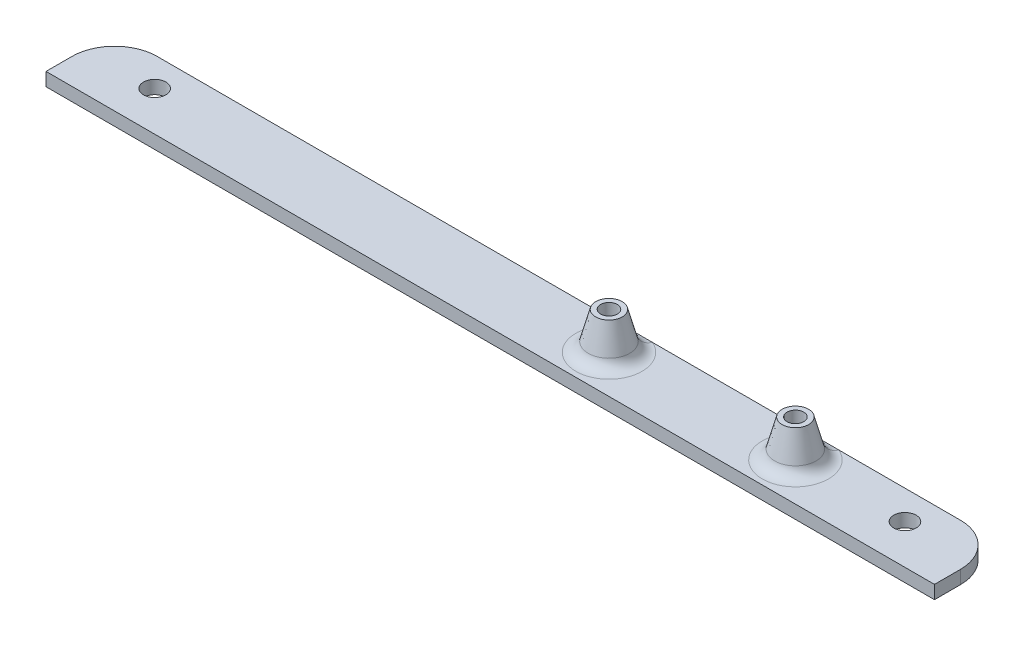
ISO-10303-21;
HEADER;
FILE_DESCRIPTION(('STEP AP214'),'2;1');
FILE_NAME('part.step','',(''),(''),'','','');
FILE_SCHEMA(('AUTOMOTIVE_DESIGN { 1 0 10303 214 1 1 1 1 }'));
ENDSEC;
DATA;
#1=APPLICATION_CONTEXT('core data for automotive mechanical design processes');
#2=APPLICATION_PROTOCOL_DEFINITION('international standard','automotive_design',2000,#1);
#3=PRODUCT_CONTEXT('',#1,'mechanical');
#4=PRODUCT('Part','Part','',(#3));
#5=PRODUCT_RELATED_PRODUCT_CATEGORY('part','',(#4));
#6=PRODUCT_DEFINITION_FORMATION('','',#4);
#7=PRODUCT_DEFINITION_CONTEXT('part definition',#1,'design');
#8=PRODUCT_DEFINITION('design','',#6,#7);
#9=PRODUCT_DEFINITION_SHAPE('','',#8);
#10=(LENGTH_UNIT() NAMED_UNIT(*) SI_UNIT(.MILLI.,.METRE.));
#11=(NAMED_UNIT(*) PLANE_ANGLE_UNIT() SI_UNIT($,.RADIAN.));
#12=(NAMED_UNIT(*) SI_UNIT($,.STERADIAN.) SOLID_ANGLE_UNIT());
#13=UNCERTAINTY_MEASURE_WITH_UNIT(LENGTH_MEASURE(1.E-05),#10,'distance_accuracy_value','');
#14=(GEOMETRIC_REPRESENTATION_CONTEXT(3) GLOBAL_UNCERTAINTY_ASSIGNED_CONTEXT((#13)) GLOBAL_UNIT_ASSIGNED_CONTEXT((#10,
#11,#12)) REPRESENTATION_CONTEXT('',''));
#15=CARTESIAN_POINT('',(0.,0.,0.));
#16=DIRECTION('',(0.,0.,1.));
#17=DIRECTION('',(1.,0.,0.));
#18=AXIS2_PLACEMENT_3D('',#15,#16,#17);
#19=CARTESIAN_POINT('',(0.,0.,0.));
#20=DIRECTION('',(0.,1.,0.));
#21=DIRECTION('',(0.,0.,1.));
#22=AXIS2_PLACEMENT_3D('',#19,#20,#21);
#23=PLANE('',#22);
#24=CARTESIAN_POINT('',(89.5476999999999,0.,-106.114051497006));
#25=DIRECTION('',(0.,1.,0.));
#26=DIRECTION('',(0.,0.,1.));
#27=AXIS2_PLACEMENT_3D('',#24,#25,#26);
#28=CIRCLE('',#27,2.667);
#29=CARTESIAN_POINT('',(89.5476999999999,0.,-103.447051497006));
#30=VERTEX_POINT('',#29);
#31=EDGE_CURVE('E175',#30,#30,#28,.F.);
#32=ORIENTED_EDGE('',*,*,#31,.T.);
#33=EDGE_LOOP('',(#32));
#34=FACE_BOUND('',#33,.T.);
#35=CARTESIAN_POINT('',(-89.5477,0.,-106.114051497006));
#36=DIRECTION('',(0.,1.,0.));
#37=DIRECTION('',(0.,0.,1.));
#38=AXIS2_PLACEMENT_3D('',#35,#36,#37);
#39=CIRCLE('',#38,2.667);
#40=CARTESIAN_POINT('',(-89.5477,0.,-103.447051497006));
#41=VERTEX_POINT('',#40);
#42=EDGE_CURVE('E177',#41,#41,#39,.T.);
#43=ORIENTED_EDGE('',*,*,#42,.F.);
#44=EDGE_LOOP('',(#43));
#45=FACE_BOUND('',#44,.T.);
#46=DIRECTION('',(0.,0.,-1.));
#47=VECTOR('',#46,1.);
#48=CARTESIAN_POINT('',(-106.045,0.,0.));
#49=LINE('',#48,#47);
#50=CARTESIAN_POINT('',(-106.045,0.,-96.6602749649171));
#51=VERTEX_POINT('',#50);
#52=CARTESIAN_POINT('',(-106.045,0.,-102.87));
#53=VERTEX_POINT('',#52);
#54=EDGE_CURVE('E169',#51,#53,#49,.T.);
#55=ORIENTED_EDGE('',*,*,#54,.F.);
#56=DIRECTION('',(1.,0.,0.));
#57=VECTOR('',#56,1.);
#58=CARTESIAN_POINT('',(0.,0.,-96.6602749649171));
#59=LINE('',#58,#57);
#60=CARTESIAN_POINT('',(106.045,0.,-96.6602749649171));
#61=VERTEX_POINT('',#60);
#62=EDGE_CURVE('E136',#51,#61,#59,.T.);
#63=ORIENTED_EDGE('',*,*,#62,.T.);
#64=DIRECTION('',(0.,0.,-1.));
#65=VECTOR('',#64,1.);
#66=CARTESIAN_POINT('',(106.045,0.,0.));
#67=LINE('',#66,#65);
#68=CARTESIAN_POINT('',(106.045,0.,-102.87));
#69=VERTEX_POINT('',#68);
#70=EDGE_CURVE('E140',#61,#69,#67,.T.);
#71=ORIENTED_EDGE('',*,*,#70,.T.);
#72=CARTESIAN_POINT('',(95.885,0.,-102.87));
#73=DIRECTION('',(0.,1.,0.));
#74=DIRECTION('',(0.,0.,1.));
#75=AXIS2_PLACEMENT_3D('',#72,#73,#74);
#76=CIRCLE('',#75,10.16);
#77=CARTESIAN_POINT('',(95.885,0.,-113.03));
#78=VERTEX_POINT('',#77);
#79=EDGE_CURVE('E186',#69,#78,#76,.T.);
#80=ORIENTED_EDGE('',*,*,#79,.T.);
#81=DIRECTION('',(1.,0.,0.));
#82=VECTOR('',#81,1.);
#83=CARTESIAN_POINT('',(0.,0.,-113.03));
#84=LINE('',#83,#82);
#85=CARTESIAN_POINT('',(66.8498739354386,0.,-113.03));
#86=VERTEX_POINT('',#85);
#87=EDGE_CURVE('E170',#86,#78,#84,.T.);
#88=ORIENTED_EDGE('',*,*,#87,.F.);
#89=CARTESIAN_POINT('',(63.7173352185795,0.,-105.789904102201));
#90=DIRECTION('',(0.,1.,0.));
#91=DIRECTION('',(0.,0.,1.));
#92=AXIS2_PLACEMENT_3D('',#89,#90,#91);
#93=CIRCLE('',#92,7.88871265935987);
#94=CARTESIAN_POINT('',(60.5847965017205,0.,-113.03));
#95=VERTEX_POINT('',#94);
#96=EDGE_CURVE('E226',#86,#95,#93,.F.);
#97=ORIENTED_EDGE('',*,*,#96,.T.);
#98=CARTESIAN_POINT('',(22.3490739354386,0.,-113.03));
#99=VERTEX_POINT('',#98);
#100=EDGE_CURVE('E343',#99,#95,#84,.T.);
#101=ORIENTED_EDGE('',*,*,#100,.F.);
#102=CARTESIAN_POINT('',(19.2165352185795,0.,-105.789904102201));
#103=DIRECTION('',(0.,1.,0.));
#104=DIRECTION('',(0.,0.,1.));
#105=AXIS2_PLACEMENT_3D('',#102,#103,#104);
#106=CIRCLE('',#105,7.88871265935987);
#107=CARTESIAN_POINT('',(16.0839965017205,0.,-113.03));
#108=VERTEX_POINT('',#107);
#109=EDGE_CURVE('E215',#99,#108,#106,.F.);
#110=ORIENTED_EDGE('',*,*,#109,.T.);
#111=CARTESIAN_POINT('',(-95.885,0.,-113.03));
#112=VERTEX_POINT('',#111);
#113=EDGE_CURVE('E164',#112,#108,#84,.T.);
#114=ORIENTED_EDGE('',*,*,#113,.F.);
#115=CARTESIAN_POINT('',(-95.885,0.,-102.87));
#116=DIRECTION('',(0.,1.,0.));
#117=DIRECTION('',(0.,0.,1.));
#118=AXIS2_PLACEMENT_3D('',#115,#116,#117);
#119=CIRCLE('',#118,10.16);
#120=EDGE_CURVE('E185',#112,#53,#119,.T.);
#121=ORIENTED_EDGE('',*,*,#120,.T.);
#122=EDGE_LOOP('',(#55,#63,#71,#80,#88,#97,#101,#110,#114,#121));
#123=FACE_BOUND('',#122,.T.);
#124=ADVANCED_FACE('F47',(#34,#45,#123),#23,.T.);
#125=CARTESIAN_POINT('',(106.045,-3.175,0.));
#126=DIRECTION('',(1.,0.,0.));
#127=DIRECTION('',(0.,0.,-1.));
#128=AXIS2_PLACEMENT_3D('',#125,#126,#127);
#129=PLANE('',#128);
#130=ORIENTED_EDGE('',*,*,#70,.F.);
#131=DIRECTION('',(0.,-1.,0.));
#132=VECTOR('',#131,1.);
#133=CARTESIAN_POINT('',(106.045,-3.175,-96.6602749649171));
#134=LINE('',#133,#132);
#135=CARTESIAN_POINT('',(106.045,-3.175,-96.6602749649171));
#136=VERTEX_POINT('',#135);
#137=EDGE_CURVE('E126',#61,#136,#134,.T.);
#138=ORIENTED_EDGE('',*,*,#137,.T.);
#139=DIRECTION('',(0.,0.,-1.));
#140=VECTOR('',#139,1.);
#141=CARTESIAN_POINT('',(106.045,-3.175,0.));
#142=LINE('',#141,#140);
#143=CARTESIAN_POINT('',(106.045,-3.175,-102.87));
#144=VERTEX_POINT('',#143);
#145=EDGE_CURVE('E133',#136,#144,#142,.T.);
#146=ORIENTED_EDGE('',*,*,#145,.T.);
#147=DIRECTION('',(0.,1.,0.));
#148=VECTOR('',#147,1.);
#149=CARTESIAN_POINT('',(106.045,0.,-102.87));
#150=LINE('',#149,#148);
#151=EDGE_CURVE('E165',#144,#69,#150,.T.);
#152=ORIENTED_EDGE('',*,*,#151,.T.);
#153=EDGE_LOOP('',(#130,#138,#146,#152));
#154=FACE_BOUND('',#153,.T.);
#155=ADVANCED_FACE('F134',(#154),#129,.T.);
#156=CARTESIAN_POINT('',(-106.045,-3.175,0.));
#157=DIRECTION('',(1.,0.,0.));
#158=DIRECTION('',(0.,0.,-1.));
#159=AXIS2_PLACEMENT_3D('',#156,#157,#158);
#160=PLANE('',#159);
#161=DIRECTION('',(0.,-1.,0.));
#162=VECTOR('',#161,1.);
#163=CARTESIAN_POINT('',(-106.045,-3.175,-96.6602749649171));
#164=LINE('',#163,#162);
#165=CARTESIAN_POINT('',(-106.045,-3.175,-96.6602749649171));
#166=VERTEX_POINT('',#165);
#167=EDGE_CURVE('E61',#51,#166,#164,.T.);
#168=ORIENTED_EDGE('',*,*,#167,.F.);
#169=ORIENTED_EDGE('',*,*,#54,.T.);
#170=DIRECTION('',(0.,1.,0.));
#171=VECTOR('',#170,1.);
#172=CARTESIAN_POINT('',(-106.045,-3.175,-102.87));
#173=LINE('',#172,#171);
#174=CARTESIAN_POINT('',(-106.045,-3.175,-102.87));
#175=VERTEX_POINT('',#174);
#176=EDGE_CURVE('E203',#53,#175,#173,.F.);
#177=ORIENTED_EDGE('',*,*,#176,.T.);
#178=DIRECTION('',(0.,0.,-1.));
#179=VECTOR('',#178,1.);
#180=CARTESIAN_POINT('',(-106.045,-3.175,0.));
#181=LINE('',#180,#179);
#182=EDGE_CURVE('E147',#166,#175,#181,.T.);
#183=ORIENTED_EDGE('',*,*,#182,.F.);
#184=EDGE_LOOP('',(#168,#169,#177,#183));
#185=FACE_BOUND('',#184,.T.);
#186=ADVANCED_FACE('F387',(#185),#160,.F.);
#187=CARTESIAN_POINT('',(0.,-3.175,0.));
#188=DIRECTION('',(0.,1.,0.));
#189=DIRECTION('',(0.,0.,1.));
#190=AXIS2_PLACEMENT_3D('',#187,#188,#189);
#191=PLANE('',#190);
#192=CARTESIAN_POINT('',(-89.5477,-3.175,-106.114051497006));
#193=DIRECTION('',(0.,1.,0.));
#194=DIRECTION('',(0.,0.,1.));
#195=AXIS2_PLACEMENT_3D('',#192,#193,#194);
#196=CIRCLE('',#195,2.667);
#197=CARTESIAN_POINT('',(-89.5477,-3.175,-103.447051497006));
#198=VERTEX_POINT('',#197);
#199=EDGE_CURVE('E152',#198,#198,#196,.T.);
#200=ORIENTED_EDGE('',*,*,#199,.T.);
#201=EDGE_LOOP('',(#200));
#202=FACE_BOUND('',#201,.T.);
#203=CARTESIAN_POINT('',(89.5476999999999,-3.175,-106.114051497006));
#204=DIRECTION('',(0.,1.,0.));
#205=DIRECTION('',(0.,0.,1.));
#206=AXIS2_PLACEMENT_3D('',#203,#204,#205);
#207=CIRCLE('',#206,2.667);
#208=CARTESIAN_POINT('',(89.5476999999999,-3.175,-103.447051497006));
#209=VERTEX_POINT('',#208);
#210=EDGE_CURVE('E149',#209,#209,#207,.F.);
#211=ORIENTED_EDGE('',*,*,#210,.F.);
#212=EDGE_LOOP('',(#211));
#213=FACE_BOUND('',#212,.T.);
#214=DIRECTION('',(1.,0.,0.));
#215=VECTOR('',#214,1.);
#216=CARTESIAN_POINT('',(0.,-3.175,-96.6602749649171));
#217=LINE('',#216,#215);
#218=EDGE_CURVE('E12',#166,#136,#217,.T.);
#219=ORIENTED_EDGE('',*,*,#218,.F.);
#220=ORIENTED_EDGE('',*,*,#182,.T.);
#221=CARTESIAN_POINT('',(-95.885,-3.175,-102.87));
#222=DIRECTION('',(0.,1.,0.));
#223=DIRECTION('',(0.,0.,1.));
#224=AXIS2_PLACEMENT_3D('',#221,#222,#223);
#225=CIRCLE('',#224,10.16);
#226=CARTESIAN_POINT('',(-95.885,-3.175,-113.03));
#227=VERTEX_POINT('',#226);
#228=EDGE_CURVE('E197',#175,#227,#225,.F.);
#229=ORIENTED_EDGE('',*,*,#228,.T.);
#230=DIRECTION('',(1.,0.,0.));
#231=VECTOR('',#230,1.);
#232=CARTESIAN_POINT('',(0.,-3.175,-113.03));
#233=LINE('',#232,#231);
#234=CARTESIAN_POINT('',(95.885,-3.175,-113.03));
#235=VERTEX_POINT('',#234);
#236=EDGE_CURVE('E154',#227,#235,#233,.T.);
#237=ORIENTED_EDGE('',*,*,#236,.T.);
#238=CARTESIAN_POINT('',(95.885,-3.175,-102.87));
#239=DIRECTION('',(0.,1.,0.));
#240=DIRECTION('',(0.,0.,1.));
#241=AXIS2_PLACEMENT_3D('',#238,#239,#240);
#242=CIRCLE('',#241,10.16);
#243=EDGE_CURVE('E145',#235,#144,#242,.F.);
#244=ORIENTED_EDGE('',*,*,#243,.T.);
#245=ORIENTED_EDGE('',*,*,#145,.F.);
#246=EDGE_LOOP('',(#219,#220,#229,#237,#244,#245));
#247=FACE_BOUND('',#246,.T.);
#248=ADVANCED_FACE('F143',(#202,#213,#247),#191,.F.);
#249=CARTESIAN_POINT('',(0.,-3.175,-113.03));
#250=DIRECTION('',(0.,0.,1.));
#251=DIRECTION('',(1.,0.,0.));
#252=AXIS2_PLACEMENT_3D('',#249,#250,#251);
#253=PLANE('',#252);
#254=ORIENTED_EDGE('',*,*,#113,.T.);
#255=EDGE_CURVE('E167',#108,#99,#84,.T.);
#256=ORIENTED_EDGE('',*,*,#255,.T.);
#257=ORIENTED_EDGE('',*,*,#100,.T.);
#258=EDGE_CURVE('E339',#95,#86,#84,.T.);
#259=ORIENTED_EDGE('',*,*,#258,.T.);
#260=ORIENTED_EDGE('',*,*,#87,.T.);
#261=DIRECTION('',(0.,1.,0.));
#262=VECTOR('',#261,1.);
#263=CARTESIAN_POINT('',(95.885,-3.175,-113.03));
#264=LINE('',#263,#262);
#265=EDGE_CURVE('E196',#78,#235,#264,.F.);
#266=ORIENTED_EDGE('',*,*,#265,.T.);
#267=ORIENTED_EDGE('',*,*,#236,.F.);
#268=DIRECTION('',(0.,1.,0.));
#269=VECTOR('',#268,1.);
#270=CARTESIAN_POINT('',(-95.885,-3.175,-113.03));
#271=LINE('',#270,#269);
#272=EDGE_CURVE('E195',#227,#112,#271,.T.);
#273=ORIENTED_EDGE('',*,*,#272,.T.);
#274=EDGE_LOOP('',(#254,#256,#257,#259,#260,#266,#267,#273));
#275=FACE_BOUND('',#274,.T.);
#276=ADVANCED_FACE('F341',(#275),#253,.F.);
#277=CARTESIAN_POINT('',(89.5476999999999,-3.175,-106.114051497006));
#278=DIRECTION('',(0.,1.,0.));
#279=DIRECTION('',(0.,0.,1.));
#280=AXIS2_PLACEMENT_3D('',#277,#278,#279);
#281=CYLINDRICAL_SURFACE('',#280,2.667);
#282=ORIENTED_EDGE('',*,*,#210,.T.);
#283=EDGE_LOOP('',(#282));
#284=FACE_BOUND('',#283,.T.);
#285=ORIENTED_EDGE('',*,*,#31,.F.);
#286=EDGE_LOOP('',(#285));
#287=FACE_BOUND('',#286,.T.);
#288=ADVANCED_FACE('F418',(#284,#287),#281,.F.);
#289=CARTESIAN_POINT('',(-89.5477,-3.175,-106.114051497006));
#290=DIRECTION('',(0.,1.,0.));
#291=DIRECTION('',(0.,0.,1.));
#292=AXIS2_PLACEMENT_3D('',#289,#290,#291);
#293=CYLINDRICAL_SURFACE('',#292,2.667);
#294=ORIENTED_EDGE('',*,*,#199,.F.);
#295=EDGE_LOOP('',(#294));
#296=FACE_BOUND('',#295,.T.);
#297=ORIENTED_EDGE('',*,*,#42,.T.);
#298=EDGE_LOOP('',(#297));
#299=FACE_BOUND('',#298,.T.);
#300=ADVANCED_FACE('F430',(#296,#299),#293,.F.);
#301=CARTESIAN_POINT('',(95.885,-3.175,-102.87));
#302=DIRECTION('',(0.,-1.,0.));
#303=DIRECTION('',(0.,0.,-1.));
#304=AXIS2_PLACEMENT_3D('',#301,#302,#303);
#305=CYLINDRICAL_SURFACE('',#304,10.16);
#306=ORIENTED_EDGE('',*,*,#243,.F.);
#307=ORIENTED_EDGE('',*,*,#265,.F.);
#308=ORIENTED_EDGE('',*,*,#79,.F.);
#309=ORIENTED_EDGE('',*,*,#151,.F.);
#310=EDGE_LOOP('',(#306,#307,#308,#309));
#311=FACE_BOUND('',#310,.T.);
#312=ADVANCED_FACE('F333',(#311),#305,.T.);
#313=CARTESIAN_POINT('',(-95.885,-3.175,-102.87));
#314=DIRECTION('',(0.,1.,0.));
#315=DIRECTION('',(0.,0.,1.));
#316=AXIS2_PLACEMENT_3D('',#313,#314,#315);
#317=CYLINDRICAL_SURFACE('',#316,10.16);
#318=ORIENTED_EDGE('',*,*,#228,.F.);
#319=ORIENTED_EDGE('',*,*,#176,.F.);
#320=ORIENTED_EDGE('',*,*,#120,.F.);
#321=ORIENTED_EDGE('',*,*,#272,.F.);
#322=EDGE_LOOP('',(#318,#319,#320,#321));
#323=FACE_BOUND('',#322,.T.);
#324=ADVANCED_FACE('F409',(#323),#317,.T.);
#325=CARTESIAN_POINT('',(19.2165352185795,0.,-105.789904102201));
#326=DIRECTION('',(0.,-1.,0.));
#327=DIRECTION('',(0.,0.,1.));
#328=AXIS2_PLACEMENT_3D('',#325,#326,#327);
#329=CONICAL_SURFACE('',#328,5.5499,0.26179938779915);
#330=CARTESIAN_POINT('',(19.2165352185795,2.25911955052751,-105.789904102201));
#331=DIRECTION('',(0.,-1.,0.));
#332=DIRECTION('',(0.,0.,-1.));
#333=AXIS2_PLACEMENT_3D('',#330,#331,#332);
#334=CIRCLE('',#333,4.94457074083079);
#335=CARTESIAN_POINT('',(17.2530894761968,2.25911955052751,-110.32792797034));
#336=VERTEX_POINT('',#335);
#337=CARTESIAN_POINT('',(21.1799809609623,2.25911955052751,-110.32792797034));
#338=VERTEX_POINT('',#337);
#339=EDGE_CURVE('E73',#336,#338,#334,.F.);
#340=ORIENTED_EDGE('',*,*,#339,.T.);
#341=CARTESIAN_POINT('',(14.9132160822023,0.,-113.03));
#342=CARTESIAN_POINT('',(16.3812284406314,-0.471610176472769,-110.716689873763));
#343=CARTESIAN_POINT('',(16.5159111278348,2.19768719480201,-109.951449845618));
#344=CARTESIAN_POINT('',(15.0990784939874,0.,-113.03));
#345=CARTESIAN_POINT('',(16.4641749273153,-0.37810453877888,-110.731149070508));
#346=CARTESIAN_POINT('',(16.6337880743699,2.22073043175689,-110.0206219783));
#347=CARTESIAN_POINT('',(15.2891512085933,0.,-113.03));
#348=CARTESIAN_POINT('',(16.5595076503276,-0.291310692988242,-110.754911667385));
#349=CARTESIAN_POINT('',(16.753758286454,2.23603311554467,-110.086830867375));
#350=CARTESIAN_POINT('',(15.6765885009795,0.,-113.03));
#351=CARTESIAN_POINT('',(16.7692330116348,-0.135034139183143,-110.812596553631));
#352=CARTESIAN_POINT('',(16.9975803656631,2.25516482520164,-110.211914543576));
#353=CARTESIAN_POINT('',(15.8739477906859,0.,-113.03));
#354=CARTESIAN_POINT('',(16.8834220730703,-0.0649534001113206,-110.846345864705));
#355=CARTESIAN_POINT('',(17.1214294082793,2.25900201242316,-110.270794518932));
#356=CARTESIAN_POINT('',(16.2759657908782,0.,-113.03));
#357=CARTESIAN_POINT('',(17.1285112039152,0.0581907318585436,-110.916749829954));
#358=CARTESIAN_POINT('',(17.3734173273652,2.2592320554057,-110.380151463016));
#359=CARTESIAN_POINT('',(16.480652416629,0.,-113.03));
#360=CARTESIAN_POINT('',(17.2595459553542,0.111718452204252,-110.953472750415));
#361=CARTESIAN_POINT('',(17.5015724619864,2.25559259317266,-110.430590928374));
#362=CARTESIAN_POINT('',(16.8956316552266,0.,-113.03));
#363=CARTESIAN_POINT('',(17.5345229730299,0.203225693554277,-111.023919777695));
#364=CARTESIAN_POINT('',(17.7613704328971,2.24449770506473,-110.52160305541));
#365=CARTESIAN_POINT('',(17.1059252576775,0.,-113.03));
#366=CARTESIAN_POINT('',(17.6787428506495,0.241613818596918,-111.057815490545));
#367=CARTESIAN_POINT('',(17.893013884832,2.23704160128831,-110.562173962373));
#368=CARTESIAN_POINT('',(17.5360200201119,0.,-113.03));
#369=CARTESIAN_POINT('',(17.9802045437102,0.305692516791633,-111.11904132115));
#370=CARTESIAN_POINT('',(18.1623805275689,2.22143845764112,-110.633181037182));
#371=CARTESIAN_POINT('',(17.7559285199165,0.,-113.03));
#372=CARTESIAN_POINT('',(18.138199595648,0.331376845521503,-111.146425349311));
#373=CARTESIAN_POINT('',(18.3001739042294,2.21327934440253,-110.663358254519));
#374=CARTESIAN_POINT('',(18.1990863514627,0.,-113.03));
#375=CARTESIAN_POINT('',(18.4605307480783,0.3707934765969,-111.190461137269));
#376=CARTESIAN_POINT('',(18.5780180329939,2.19929658269627,-110.711256920692));
#377=CARTESIAN_POINT('',(18.4223353109197,0.,-113.03));
#378=CARTESIAN_POINT('',(18.6255049055098,0.384709441433339,-111.20729633352));
#379=CARTESIAN_POINT('',(18.7180685336801,2.19347267595798,-110.728979747132));
#380=CARTESIAN_POINT('',(18.8697270506103,0.,-113.03));
#381=CARTESIAN_POINT('',(18.957448010026,0.40199512408667,-111.228468577268));
#382=CARTESIAN_POINT('',(18.998827737933,2.18601921120185,-110.751277812987));
#383=CARTESIAN_POINT('',(19.0938643922879,0.,-113.03));
#384=CARTESIAN_POINT('',(19.1251315217836,0.405477478706701,-111.232940617246));
#385=CARTESIAN_POINT('',(19.1395327056684,2.18437577407803,-110.755896563676));
#386=CARTESIAN_POINT('',(19.5418429696453,0.,-113.03));
#387=CARTESIAN_POINT('',(19.4591659853686,0.402449506842503,-111.229139764229));
#388=CARTESIAN_POINT('',(19.42073840293,2.18574760244863,-110.751925778176));
#389=CARTESIAN_POINT('',(19.7656842129895,0.,-113.03));
#390=CARTESIAN_POINT('',(19.6262654254359,0.395925908517852,-111.220850081048));
#391=CARTESIAN_POINT('',(19.5612391377523,2.1887627448996,-110.743336590839));
#392=CARTESIAN_POINT('',(20.1967557100874,0.,-113.03));
#393=CARTESIAN_POINT('',(19.9446603690179,0.373079135694928,-111.193445246691));
#394=CARTESIAN_POINT('',(19.8316954028262,2.19820153688403,-110.71426489814));
#395=CARTESIAN_POINT('',(20.4041232204609,0.,-113.03));
#396=CARTESIAN_POINT('',(20.0969229007197,0.35732440704069,-111.174957743806));
#397=CARTESIAN_POINT('',(19.9617447779844,2.2043918945923,-110.694588324031));
#398=CARTESIAN_POINT('',(20.8156397295903,0.,-113.03));
#399=CARTESIAN_POINT('',(20.3941674162368,0.315398262594447,-111.129531676619));
#400=CARTESIAN_POINT('',(20.2196835506754,2.21827733561273,-110.644599952071));
#401=CARTESIAN_POINT('',(21.0197886823148,0.,-113.03));
#402=CARTESIAN_POINT('',(20.5396421053324,0.289057321136175,-111.102434217699));
#403=CARTESIAN_POINT('',(20.3475729173178,2.22597244042458,-110.614288002259));
#404=CARTESIAN_POINT('',(21.4241653799833,0.,-113.03));
#405=CARTESIAN_POINT('',(20.8208801710518,0.224320533245156,-111.042510987716));
#406=CARTESIAN_POINT('',(20.6007981185568,2.24043329594097,-110.543790918138));
#407=CARTESIAN_POINT('',(21.6243850956624,0.,-113.03));
#408=CARTESIAN_POINT('',(20.9569951675863,0.185636448625781,-111.00949718378));
#409=CARTESIAN_POINT('',(20.7261287420168,2.24719728537939,-110.503587462983));
#410=CARTESIAN_POINT('',(22.0196304597248,0.,-113.03));
#411=CARTESIAN_POINT('',(21.216619384798,0.0945728075647432,-110.941594358031));
#412=CARTESIAN_POINT('',(20.9735819799053,2.25683842800554,-110.414286220727));
#413=CARTESIAN_POINT('',(22.2146562497031,0.,-113.03));
#414=CARTESIAN_POINT('',(21.3403468438393,0.0418205212938573,-110.906563701227));
#415=CARTESIAN_POINT('',(21.0957046817857,2.25971568725855,-110.365188676379));
#416=CARTESIAN_POINT('',(22.5802342987054,0.,-113.03));
#417=CARTESIAN_POINT('',(21.5612736124322,-0.0727137151742717,-110.842891904783));
#418=CARTESIAN_POINT('',(21.3249002774319,2.25838294533514,-110.264237892472));
#419=CARTESIAN_POINT('',(22.7513369826149,0.,-113.03));
#420=CARTESIAN_POINT('',(21.6600921525987,-0.133602730677323,-110.813879602495));
#421=CARTESIAN_POINT('',(21.4322913847132,2.25482764720663,-110.213103254829));
#422=CARTESIAN_POINT('',(23.087932850586,0.,-113.03));
#423=CARTESIAN_POINT('',(21.8435112014975,-0.267736918616066,-110.762966183933));
#424=CARTESIAN_POINT('',(21.6440469461969,2.23928859723246,-110.105301242741));
#425=CARTESIAN_POINT('',(23.2534287808346,0.,-113.03));
#426=CARTESIAN_POINT('',(21.9280037761252,-0.341364372793962,-110.741159172611));
#427=CARTESIAN_POINT('',(21.7484128784036,2.22730903602716,-110.048636631242));
#428=CARTESIAN_POINT('',(23.578296380838,0.,-113.03));
#429=CARTESIAN_POINT('',(22.0811628066497,-0.500081272110058,-110.710069507839));
#430=CARTESIAN_POINT('',(21.9541020549495,2.19219993820286,-109.930695455724));
#431=CARTESIAN_POINT('',(23.7376639091343,0.,-113.03));
#432=CARTESIAN_POINT('',(22.1495574117969,-0.585555973560814,-110.701064944187));
#433=CARTESIAN_POINT('',(22.0554232319352,2.16906299980176,-109.869415852934));
#434=CARTESIAN_POINT('',(24.0495673791882,0.,-113.03));
#435=CARTESIAN_POINT('',(22.2696632104893,-0.764845700743243,-110.701168597262));
#436=CARTESIAN_POINT('',(22.254940043101,2.10881228477234,-109.743481589416));
#437=CARTESIAN_POINT('',(24.2020907832082,0.,-113.03));
#438=CARTESIAN_POINT('',(22.320961031992,-0.858945404827245,-110.710768147238));
#439=CARTESIAN_POINT('',(22.3531298528222,2.07167394206906,-109.678821169651));
#440=CARTESIAN_POINT('',(24.3506133115392,0.,-113.03));
#441=CARTESIAN_POINT('',(22.3625489785834,-0.953850553692775,-110.732478571319));
#442=CARTESIAN_POINT('',(22.4495696663039,2.02615647400661,-109.613183748331));
#443=(BOUNDED_SURFACE() B_SPLINE_SURFACE(3,2,((#341,#342,#343),(#344,#345,#346),(#347,#348,
#349),(#350,#351,#352),(#353,#354,#355),(#356,#357,#358),(#359,#360,#361),(#362,#363,#364),
(#365,#366,#367),(#368,#369,#370),(#371,#372,#373),(#374,#375,#376),(#377,#378,#379),(#380,#381,
#382),(#383,#384,#385),(#386,#387,#388),(#389,#390,#391),(#392,#393,#394),(#395,#396,#397),
(#398,#399,#400),(#401,#402,#403),(#404,#405,#406),(#407,#408,#409),(#410,#411,#412),(#413,#414,
#415),(#416,#417,#418),(#419,#420,#421),(#422,#423,#424),(#425,#426,#427),(#428,#429,#430),
(#431,#432,#433),(#434,#435,#436),(#437,#438,#439),(#440,#441,#442)),.UNSPECIFIED.,.F.,.F.,
.F.) B_SPLINE_SURFACE_WITH_KNOTS((4,2,2,2,2,2,2,2,2,2,2,2,2,2,2,2,4),(3,3),(0.,
0.656237056995104,1.31200688091315,1.97061724895001,2.62934463818729,3.30346339709788,
3.97750757882937,4.6493110042905,5.32109668623343,5.94939311916079,6.57769852979267,
7.20717655332194,7.83663739862943,8.4055888097366,8.97425739661799,9.54330375719002,
10.1133532163764),(0.,1.),
.UNSPECIFIED.) GEOMETRIC_REPRESENTATION_ITEM() RATIONAL_B_SPLINE_SURFACE(((1.,0.738831823682083,
1.),(1.,0.748713900066475,1.),(1.,0.758263158817086,1.),(1.,0.776405500059988,1.),(1.,
0.784999258497764,1.),(1.,0.800989495053761,1.),(1.,0.808380625767536,1.),(1.,0.821712257662104,
1.),(1.,0.827652500863223,1.),(1.,0.838033947433949,1.),(1.,0.842436882270362,1.),(1.,
0.849415547709758,1.),(1.,0.851991480400888,1.),(1.,0.855230925355298,1.),(1.,0.85590076669897,
1.),(1.,0.855324384495093,1.),(1.,0.854078211553743,1.),(1.,0.84985175615807,1.),(1.,
0.846988956914588,1.),(1.,0.839699885272726,1.),(1.,0.835273590534521,1.),(1.,0.824961757122823,
1.),(1.,0.819073510464547,1.),(1.,0.805991949055739,1.),(1.,0.798798669924417,1.),(1.,
0.784044082017075,1.),(1.,0.776584623085506,1.),(1.,0.760936756533549,1.),(1.,0.752748713114882,
1.),(1.,0.735848337029004,1.),(1.,0.72713565968333,1.),(1.,0.709434930889954,1.),(1.,
0.700446421094127,1.),(1.,0.691458037311459,1.))) REPRESENTATION_ITEM('') SURFACE());
#444=CARTESIAN_POINT('',(22.4495696663039,2.02615647400661,-109.613183748331));
#445=CARTESIAN_POINT('',(22.3531298528222,2.07167394206906,-109.678821169651));
#446=CARTESIAN_POINT('',(22.254940043101,2.10881228477234,-109.743481589416));
#447=CARTESIAN_POINT('',(22.0554232319352,2.16906299980176,-109.869415852934));
#448=CARTESIAN_POINT('',(21.9541020549495,2.19219993820286,-109.930695455724));
#449=CARTESIAN_POINT('',(21.7484128784036,2.22730903602716,-110.048636631242));
#450=CARTESIAN_POINT('',(21.6440469461969,2.23928859723246,-110.105301242741));
#451=CARTESIAN_POINT('',(21.4322913847132,2.25482764720663,-110.213103254829));
#452=CARTESIAN_POINT('',(21.3249002774319,2.25838294533514,-110.264237892472));
#453=CARTESIAN_POINT('',(21.0957046817857,2.25971568725855,-110.365188676379));
#454=CARTESIAN_POINT('',(20.9735819799053,2.25683842800554,-110.414286220727));
#455=CARTESIAN_POINT('',(20.7261287420168,2.24719728537939,-110.503587462983));
#456=CARTESIAN_POINT('',(20.6007981185568,2.24043329594097,-110.543790918138));
#457=CARTESIAN_POINT('',(20.3475729173178,2.22597244042458,-110.614288002259));
#458=CARTESIAN_POINT('',(20.2196835506754,2.21827733561273,-110.644599952071));
#459=CARTESIAN_POINT('',(19.9617447779844,2.2043918945923,-110.694588324031));
#460=CARTESIAN_POINT('',(19.8316954028262,2.19820153688403,-110.71426489814));
#461=CARTESIAN_POINT('',(19.5612391377523,2.18876274489961,-110.743336590839));
#462=CARTESIAN_POINT('',(19.42073840293,2.18574760244863,-110.751925778176));
#463=CARTESIAN_POINT('',(19.1395327056684,2.18437577407803,-110.755896563676));
#464=CARTESIAN_POINT('',(18.998827737933,2.18601921120185,-110.751277812987));
#465=CARTESIAN_POINT('',(18.7180685336801,2.19347267595798,-110.728979747132));
#466=CARTESIAN_POINT('',(18.5780180329939,2.19929658269627,-110.711256920692));
#467=CARTESIAN_POINT('',(18.3001739042294,2.21327934440253,-110.663358254519));
#468=CARTESIAN_POINT('',(18.1623805275689,2.22143845764112,-110.633181037182));
#469=CARTESIAN_POINT('',(17.893013884832,2.23704160128831,-110.562173962373));
#470=CARTESIAN_POINT('',(17.7613704328971,2.24449770506473,-110.52160305541));
#471=CARTESIAN_POINT('',(17.5015724619864,2.25559259317266,-110.430590928374));
#472=CARTESIAN_POINT('',(17.3734173273652,2.2592320554057,-110.380151463016));
#473=CARTESIAN_POINT('',(17.1214294082793,2.25900201242316,-110.270794518932));
#474=CARTESIAN_POINT('',(16.9975803656631,2.25516482520164,-110.211914543576));
#475=CARTESIAN_POINT('',(16.753758286454,2.23603311554467,-110.086830867375));
#476=CARTESIAN_POINT('',(16.6337880743699,2.22073043175689,-110.0206219783));
#477=CARTESIAN_POINT('',(16.5159111278348,2.19768719480201,-109.951449845618));
#478=B_SPLINE_CURVE_WITH_KNOTS('',3,(#444,#445,#446,#447,#448,#449,#450,#451,#452,#453,#454,
#455,#456,#457,#458,#459,#460,#461,#462,#463,#464,#465,#466,#467,#468,#469,#470,#471,#472,#473,
#474,#475,#476,#477),.UNSPECIFIED.,.F.,.F.,(4,2,2,2,2,2,2,2,2,2,2,2,2,2,2,2,4),(0.,
0.570049459186407,1.13909581975844,1.70776440663983,2.276715817747,2.90617666305449,
3.53565468658376,4.16396009721564,4.79225653014301,5.46404221208593,6.13584563754706,
6.80988981927855,7.48400857818914,8.14273596742642,8.80134633546328,9.45711615938133,
10.1133532163764),.UNSPECIFIED.);
#479=EDGE_CURVE('E59',#338,#336,#478,.T.);
#480=ORIENTED_EDGE('',*,*,#479,.T.);
#481=EDGE_LOOP('',(#340,#480));
#482=FACE_BOUND('',#481,.T.);
#483=CARTESIAN_POINT('',(19.2165352185795,8.89,-105.789904102201));
#484=DIRECTION('',(0.,1.,0.));
#485=DIRECTION('',(0.,0.,1.));
#486=AXIS2_PLACEMENT_3D('',#483,#484,#485);
#487=CIRCLE('',#486,3.16783167928731);
#488=CARTESIAN_POINT('',(19.2165352185795,8.89,-102.622072422914));
#489=VERTEX_POINT('',#488);
#490=EDGE_CURVE('E214',#489,#489,#487,.F.);
#491=ORIENTED_EDGE('',*,*,#490,.T.);
#492=EDGE_LOOP('',(#491));
#493=FACE_BOUND('',#492,.T.);
#494=ADVANCED_FACE('F246',(#482,#493),#329,.T.);
#495=CARTESIAN_POINT('',(19.2165352185795,8.89,-105.789904102201));
#496=DIRECTION('',(0.,-1.,0.));
#497=DIRECTION('',(0.,0.,-1.));
#498=AXIS2_PLACEMENT_3D('',#495,#496,#497);
#499=CYLINDRICAL_SURFACE('',#498,1.9939);
#500=CARTESIAN_POINT('',(19.2165352185795,8.89,-105.789904102201));
#501=DIRECTION('',(0.,1.,0.));
#502=DIRECTION('',(0.,0.,1.));
#503=AXIS2_PLACEMENT_3D('',#500,#501,#502);
#504=CIRCLE('',#503,1.9939);
#505=CARTESIAN_POINT('',(19.2165352185795,8.89,-103.796004102201));
#506=VERTEX_POINT('',#505);
#507=EDGE_CURVE('E219',#506,#506,#504,.F.);
#508=ORIENTED_EDGE('',*,*,#507,.F.);
#509=EDGE_LOOP('',(#508));
#510=FACE_BOUND('',#509,.T.);
#511=CARTESIAN_POINT('',(19.2165352185795,0.,-105.789904102201));
#512=DIRECTION('',(0.,1.,0.));
#513=DIRECTION('',(0.,0.,1.));
#514=AXIS2_PLACEMENT_3D('',#511,#512,#513);
#515=CIRCLE('',#514,1.9939);
#516=CARTESIAN_POINT('',(19.2165352185795,0.,-103.796004102201));
#517=VERTEX_POINT('',#516);
#518=EDGE_CURVE('E217',#517,#517,#515,.F.);
#519=ORIENTED_EDGE('',*,*,#518,.T.);
#520=EDGE_LOOP('',(#519));
#521=FACE_BOUND('',#520,.T.);
#522=ADVANCED_FACE('F397',(#510,#521),#499,.F.);
#523=CARTESIAN_POINT('',(0.,8.89,0.));
#524=DIRECTION('',(0.,1.,0.));
#525=DIRECTION('',(0.,0.,1.));
#526=AXIS2_PLACEMENT_3D('',#523,#524,#525);
#527=PLANE('',#526);
#528=ORIENTED_EDGE('',*,*,#490,.F.);
#529=EDGE_LOOP('',(#528));
#530=FACE_BOUND('',#529,.T.);
#531=ORIENTED_EDGE('',*,*,#507,.T.);
#532=EDGE_LOOP('',(#531));
#533=FACE_BOUND('',#532,.T.);
#534=ADVANCED_FACE('F396',(#530,#533),#527,.T.);
#535=CARTESIAN_POINT('',(63.7173352185795,8.89,-105.789904102201));
#536=DIRECTION('',(0.,-1.,0.));
#537=DIRECTION('',(0.,0.,-1.));
#538=AXIS2_PLACEMENT_3D('',#535,#536,#537);
#539=CYLINDRICAL_SURFACE('',#538,1.99389999999999);
#540=CARTESIAN_POINT('',(63.7173352185795,8.89,-105.789904102201));
#541=DIRECTION('',(0.,1.,0.));
#542=DIRECTION('',(0.,0.,1.));
#543=AXIS2_PLACEMENT_3D('',#540,#541,#542);
#544=CIRCLE('',#543,1.99389999999999);
#545=CARTESIAN_POINT('',(63.7173352185795,8.89,-103.796004102201));
#546=VERTEX_POINT('',#545);
#547=EDGE_CURVE('E222',#546,#546,#544,.T.);
#548=ORIENTED_EDGE('',*,*,#547,.T.);
#549=EDGE_LOOP('',(#548));
#550=FACE_BOUND('',#549,.T.);
#551=CARTESIAN_POINT('',(63.7173352185795,0.,-105.789904102201));
#552=DIRECTION('',(0.,1.,0.));
#553=DIRECTION('',(0.,0.,1.));
#554=AXIS2_PLACEMENT_3D('',#551,#552,#553);
#555=CIRCLE('',#554,1.99389999999999);
#556=CARTESIAN_POINT('',(63.7173352185795,0.,-103.796004102201));
#557=VERTEX_POINT('',#556);
#558=EDGE_CURVE('E209',#557,#557,#555,.F.);
#559=ORIENTED_EDGE('',*,*,#558,.T.);
#560=EDGE_LOOP('',(#559));
#561=FACE_BOUND('',#560,.T.);
#562=ADVANCED_FACE('F363',(#550,#561),#539,.F.);
#563=CARTESIAN_POINT('',(63.7173352185795,0.,-105.789904102201));
#564=DIRECTION('',(0.,-1.,0.));
#565=DIRECTION('',(0.,0.,1.));
#566=AXIS2_PLACEMENT_3D('',#563,#564,#565);
#567=CONICAL_SURFACE('',#566,5.5499,0.26179938779915);
#568=CARTESIAN_POINT('',(63.7173352185795,2.25911955052752,-105.789904102201));
#569=DIRECTION('',(0.,1.,0.));
#570=DIRECTION('',(0.,0.,1.));
#571=AXIS2_PLACEMENT_3D('',#568,#569,#570);
#572=CIRCLE('',#571,4.94457074083079);
#573=CARTESIAN_POINT('',(61.7538894761968,2.25911955052752,-110.32792797034));
#574=VERTEX_POINT('',#573);
#575=CARTESIAN_POINT('',(65.6807809609623,2.25911955052752,-110.32792797034));
#576=VERTEX_POINT('',#575);
#577=EDGE_CURVE('E228',#574,#576,#572,.T.);
#578=ORIENTED_EDGE('',*,*,#577,.T.);
#579=CARTESIAN_POINT('',(66.4179593093242,2.19768719480201,-109.951449845618));
#580=CARTESIAN_POINT('',(66.5526419965277,-0.47161017647276,-110.716689873763));
#581=CARTESIAN_POINT('',(68.0206543549567,0.,-113.03));
#582=CARTESIAN_POINT('',(66.3000823627891,2.22073043175689,-110.0206219783));
#583=CARTESIAN_POINT('',(66.4696955098438,-0.378104538778883,-110.731149070508));
#584=CARTESIAN_POINT('',(67.8347919431716,0.,-113.03));
#585=CARTESIAN_POINT('',(66.1801121507051,2.23603311554468,-110.086830867375));
#586=CARTESIAN_POINT('',(66.3743627868315,-0.291310692988246,-110.754911667385));
#587=CARTESIAN_POINT('',(67.6447192285657,0.,-113.03));
#588=CARTESIAN_POINT('',(65.9362900714959,2.25516482520164,-110.211914543576));
#589=CARTESIAN_POINT('',(66.1646374255242,-0.135034139183141,-110.812596553631));
#590=CARTESIAN_POINT('',(67.2572819361795,0.,-113.03));
#591=CARTESIAN_POINT('',(65.8124410288798,2.25900201242316,-110.270794518932));
#592=CARTESIAN_POINT('',(66.0504483640888,-0.0649534001113119,-110.846345864705));
#593=CARTESIAN_POINT('',(67.0599226464732,0.,-113.03));
#594=CARTESIAN_POINT('',(65.5604531097938,2.2592320554057,-110.380151463016));
#595=CARTESIAN_POINT('',(65.8053592332438,0.0581907318585546,-110.916749829954));
#596=CARTESIAN_POINT('',(66.6579046462809,0.,-113.03));
#597=CARTESIAN_POINT('',(65.4322979751727,2.25559259317266,-110.430590928374));
#598=CARTESIAN_POINT('',(65.6743244818048,0.111718452204259,-110.953472750415));
#599=CARTESIAN_POINT('',(66.4532180205301,0.,-113.03));
#600=CARTESIAN_POINT('',(65.1725000042619,2.24449770506473,-110.52160305541));
#601=CARTESIAN_POINT('',(65.3993474641291,0.203225693554283,-111.023919777695));
#602=CARTESIAN_POINT('',(66.0382387819324,0.,-113.03));
#603=CARTESIAN_POINT('',(65.040856552327,2.23704160128831,-110.562173962373));
#604=CARTESIAN_POINT('',(65.2551275865095,0.241613818596927,-111.057815490545));
#605=CARTESIAN_POINT('',(65.8279451794815,0.,-113.03));
#606=CARTESIAN_POINT('',(64.7714899095901,2.22143845764112,-110.633181037182));
#607=CARTESIAN_POINT('',(64.9536658934488,0.305692516791639,-111.11904132115));
#608=CARTESIAN_POINT('',(65.3978504170471,0.,-113.03));
#609=CARTESIAN_POINT('',(64.6336965329297,2.21327934440253,-110.663358254519));
#610=CARTESIAN_POINT('',(64.795670841511,0.331376845521503,-111.146425349311));
#611=CARTESIAN_POINT('',(65.1779419172426,0.,-113.03));
#612=CARTESIAN_POINT('',(64.3558524041651,2.19929658269627,-110.711256920692));
#613=CARTESIAN_POINT('',(64.4733396890807,0.370793476596896,-111.190461137269));
#614=CARTESIAN_POINT('',(64.7347840856963,0.,-113.03));
#615=CARTESIAN_POINT('',(64.215801903479,2.19347267595799,-110.728979747132));
#616=CARTESIAN_POINT('',(64.3083655316492,0.384709441433339,-111.20729633352));
#617=CARTESIAN_POINT('',(64.5115351262393,0.,-113.03));
#618=CARTESIAN_POINT('',(63.935042699226,2.18601921120185,-110.751277812987));
#619=CARTESIAN_POINT('',(63.976422427133,0.401995124086672,-111.228468577268));
#620=CARTESIAN_POINT('',(64.0641433865487,0.,-113.03));
#621=CARTESIAN_POINT('',(63.7943377314906,2.18437577407803,-110.755896563676));
#622=CARTESIAN_POINT('',(63.8087389153755,0.405477478706701,-111.232940617246));
#623=CARTESIAN_POINT('',(63.8400060448711,0.,-113.03));
#624=CARTESIAN_POINT('',(63.513132034229,2.18574760244863,-110.751925778176));
#625=CARTESIAN_POINT('',(63.4747044517904,0.402449506842502,-111.229139764229));
#626=CARTESIAN_POINT('',(63.3920274675137,0.,-113.03));
#627=CARTESIAN_POINT('',(63.3726312994067,2.1887627448996,-110.743336590839));
#628=CARTESIAN_POINT('',(63.3076050117231,0.395925908517851,-111.220850081048));
#629=CARTESIAN_POINT('',(63.1681862241695,0.,-113.03));
#630=CARTESIAN_POINT('',(63.1021750343328,2.19820153688403,-110.71426489814));
#631=CARTESIAN_POINT('',(62.9892100681411,0.373079135694927,-111.193445246691));
#632=CARTESIAN_POINT('',(62.7371147270716,0.,-113.03));
#633=CARTESIAN_POINT('',(62.9721256591746,2.20439189459231,-110.694588324031));
#634=CARTESIAN_POINT('',(62.8369475364394,0.357324407040689,-111.174957743806));
#635=CARTESIAN_POINT('',(62.5297472166982,0.,-113.03));
#636=CARTESIAN_POINT('',(62.7141868864837,2.21827733561273,-110.644599952071));
#637=CARTESIAN_POINT('',(62.5397030209223,0.315398262594447,-111.129531676619));
#638=CARTESIAN_POINT('',(62.1182307075687,0.,-113.03));
#639=CARTESIAN_POINT('',(62.5862975198413,2.22597244042457,-110.614288002259));
#640=CARTESIAN_POINT('',(62.3942283318266,0.289057321136176,-111.102434217699));
#641=CARTESIAN_POINT('',(61.9140817548442,0.,-113.03));
#642=CARTESIAN_POINT('',(62.3330723186022,2.24043329594097,-110.543790918138));
#643=CARTESIAN_POINT('',(62.1129902661072,0.224320533245154,-111.042510987716));
#644=CARTESIAN_POINT('',(61.5097050571758,0.,-113.03));
#645=CARTESIAN_POINT('',(62.2077416951422,2.24719728537939,-110.503587462983));
#646=CARTESIAN_POINT('',(61.9768752695728,0.185636448625775,-111.00949718378));
#647=CARTESIAN_POINT('',(61.3094853414966,0.,-113.03));
#648=CARTESIAN_POINT('',(61.9602884572538,2.25683842800554,-110.414286220727));
#649=CARTESIAN_POINT('',(61.7172510523611,0.0945728075647325,-110.941594358031));
#650=CARTESIAN_POINT('',(60.9142399774343,0.,-113.03));
#651=CARTESIAN_POINT('',(61.8381657553733,2.25971568725855,-110.365188676379));
#652=CARTESIAN_POINT('',(61.5935235933198,0.0418205212938473,-110.906563701227));
#653=CARTESIAN_POINT('',(60.7192141874559,0.,-113.03));
#654=CARTESIAN_POINT('',(61.6089701597271,2.25838294533514,-110.264237892472));
#655=CARTESIAN_POINT('',(61.3725968247268,-0.0727137151742809,-110.842891904783));
#656=CARTESIAN_POINT('',(60.3536361384537,0.,-113.03));
#657=CARTESIAN_POINT('',(61.5015790524459,2.25482764720662,-110.213103254829));
#658=CARTESIAN_POINT('',(61.2737782845603,-0.133602730677332,-110.813879602495));
#659=CARTESIAN_POINT('',(60.1825334545442,0.,-113.03));
#660=CARTESIAN_POINT('',(61.2898234909621,2.23928859723246,-110.105301242741));
#661=CARTESIAN_POINT('',(61.0903592356615,-0.267736918616077,-110.762966183933));
#662=CARTESIAN_POINT('',(59.845937586573,0.,-113.03));
#663=CARTESIAN_POINT('',(61.1854575587555,2.22730903602716,-110.048636631242));
#664=CARTESIAN_POINT('',(61.0058666610339,-0.341364372793976,-110.741159172611));
#665=CARTESIAN_POINT('',(59.6804416563244,0.,-113.03));
#666=CARTESIAN_POINT('',(60.9797683822095,2.19219993820286,-109.930695455724));
#667=CARTESIAN_POINT('',(60.8527076305094,-0.500081272110068,-110.710069507839));
#668=CARTESIAN_POINT('',(59.355574056321,0.,-113.03));
#669=CARTESIAN_POINT('',(60.8784472052238,2.16906299980175,-109.869415852934));
#670=CARTESIAN_POINT('',(60.7843130253621,-0.585555973560818,-110.701064944187));
#671=CARTESIAN_POINT('',(59.1962065280247,0.,-113.03));
#672=CARTESIAN_POINT('',(60.678930394058,2.10881228477233,-109.743481589416));
#673=CARTESIAN_POINT('',(60.6642072266697,-0.764845700743238,-110.701168597262));
#674=CARTESIAN_POINT('',(58.8843030579708,0.,-113.03));
#675=CARTESIAN_POINT('',(60.5807405843368,2.07167394206905,-109.678821169651));
#676=CARTESIAN_POINT('',(60.612909405167,-0.858945404827237,-110.710768147238));
#677=CARTESIAN_POINT('',(58.7317796539509,0.,-113.03));
#678=CARTESIAN_POINT('',(60.4843007708552,2.02615647400661,-109.613183748331));
#679=CARTESIAN_POINT('',(60.5713214585756,-0.953850553692775,-110.732478571319));
#680=CARTESIAN_POINT('',(58.5832571256199,0.,-113.03));
#681=(BOUNDED_SURFACE() B_SPLINE_SURFACE(3,2,((#579,#580,#581),(#582,#583,#584),(#585,#586,
#587),(#588,#589,#590),(#591,#592,#593),(#594,#595,#596),(#597,#598,#599),(#600,#601,#602),
(#603,#604,#605),(#606,#607,#608),(#609,#610,#611),(#612,#613,#614),(#615,#616,#617),(#618,#619,
#620),(#621,#622,#623),(#624,#625,#626),(#627,#628,#629),(#630,#631,#632),(#633,#634,#635),
(#636,#637,#638),(#639,#640,#641),(#642,#643,#644),(#645,#646,#647),(#648,#649,#650),(#651,#652,
#653),(#654,#655,#656),(#657,#658,#659),(#660,#661,#662),(#663,#664,#665),(#666,#667,#668),
(#669,#670,#671),(#672,#673,#674),(#675,#676,#677),(#678,#679,#680)),.UNSPECIFIED.,.F.,.F.,
.F.) B_SPLINE_SURFACE_WITH_KNOTS((4,2,2,2,2,2,2,2,2,2,2,2,2,2,2,2,4),(3,3),(0.,
0.656237056995103,1.31200688091316,1.97061724895004,2.62934463818732,3.30346339709792,
3.9775075788294,4.64931100429054,5.32109668623344,5.94939311916081,6.57769852979269,
7.20717655332196,7.83663739862945,8.40558880973662,8.97425739661801,9.54330375719004,
10.1133532163764),(0.,1.),
.UNSPECIFIED.) GEOMETRIC_REPRESENTATION_ITEM() RATIONAL_B_SPLINE_SURFACE(((1.,0.738831823682084,
1.),(1.,0.748713900066474,1.),(1.,0.758263158817086,1.),(1.,0.776405500059988,1.),(1.,
0.784999258497766,1.),(1.,0.800989495053763,1.),(1.,0.808380625767537,1.),(1.,0.821712257662105,
1.),(1.,0.827652500863225,1.),(1.,0.83803394743395,1.),(1.,0.842436882270363,1.),(1.,
0.849415547709758,1.),(1.,0.851991480400888,1.),(1.,0.855230925355298,1.),(1.,0.85590076669897,
1.),(1.,0.855324384495093,1.),(1.,0.854078211553743,1.),(1.,0.84985175615807,1.),(1.,
0.846988956914587,1.),(1.,0.839699885272726,1.),(1.,0.835273590534521,1.),(1.,0.824961757122823,
1.),(1.,0.819073510464547,1.),(1.,0.805991949055738,1.),(1.,0.798798669924416,1.),(1.,
0.784044082017074,1.),(1.,0.776584623085504,1.),(1.,0.760936756533548,1.),(1.,0.75274871311488,
1.),(1.,0.735848337029003,1.),(1.,0.72713565968333,1.),(1.,0.709434930889955,1.),(1.,
0.700446421094128,1.),(1.,0.691458037311459,1.))) REPRESENTATION_ITEM('') SURFACE());
#682=CARTESIAN_POINT('',(66.4179593093242,2.19768719480201,-109.951449845618));
#683=CARTESIAN_POINT('',(66.3000823627891,2.22073043175689,-110.0206219783));
#684=CARTESIAN_POINT('',(66.1801121507051,2.23603311554468,-110.086830867375));
#685=CARTESIAN_POINT('',(65.9362900714959,2.25516482520164,-110.211914543576));
#686=CARTESIAN_POINT('',(65.8124410288798,2.25900201242316,-110.270794518932));
#687=CARTESIAN_POINT('',(65.5604531097938,2.2592320554057,-110.380151463016));
#688=CARTESIAN_POINT('',(65.4322979751726,2.25559259317266,-110.430590928374));
#689=CARTESIAN_POINT('',(65.1725000042619,2.24449770506473,-110.52160305541));
#690=CARTESIAN_POINT('',(65.040856552327,2.23704160128831,-110.562173962373));
#691=CARTESIAN_POINT('',(64.7714899095901,2.22143845764112,-110.633181037182));
#692=CARTESIAN_POINT('',(64.6336965329297,2.21327934440253,-110.663358254519));
#693=CARTESIAN_POINT('',(64.3558524041651,2.19929658269627,-110.711256920692));
#694=CARTESIAN_POINT('',(64.215801903479,2.19347267595799,-110.728979747132));
#695=CARTESIAN_POINT('',(63.935042699226,2.18601921120185,-110.751277812987));
#696=CARTESIAN_POINT('',(63.7943377314906,2.18437577407803,-110.755896563676));
#697=CARTESIAN_POINT('',(63.513132034229,2.18574760244863,-110.751925778176));
#698=CARTESIAN_POINT('',(63.3726312994067,2.18876274489961,-110.743336590839));
#699=CARTESIAN_POINT('',(63.1021750343328,2.19820153688403,-110.71426489814));
#700=CARTESIAN_POINT('',(62.9721256591746,2.20439189459231,-110.694588324031));
#701=CARTESIAN_POINT('',(62.7141868864837,2.21827733561272,-110.644599952071));
#702=CARTESIAN_POINT('',(62.5862975198413,2.22597244042457,-110.614288002259));
#703=CARTESIAN_POINT('',(62.3330723186023,2.24043329594097,-110.543790918138));
#704=CARTESIAN_POINT('',(62.2077416951422,2.24719728537939,-110.503587462983));
#705=CARTESIAN_POINT('',(61.9602884572538,2.25683842800554,-110.414286220727));
#706=CARTESIAN_POINT('',(61.8381657553733,2.25971568725855,-110.365188676379));
#707=CARTESIAN_POINT('',(61.6089701597271,2.25838294533514,-110.264237892472));
#708=CARTESIAN_POINT('',(61.5015790524459,2.25482764720663,-110.213103254829));
#709=CARTESIAN_POINT('',(61.2898234909621,2.23928859723246,-110.105301242741));
#710=CARTESIAN_POINT('',(61.1854575587555,2.22730903602716,-110.048636631242));
#711=CARTESIAN_POINT('',(60.9797683822095,2.19219993820286,-109.930695455724));
#712=CARTESIAN_POINT('',(60.8784472052238,2.16906299980175,-109.869415852934));
#713=CARTESIAN_POINT('',(60.678930394058,2.10881228477233,-109.743481589416));
#714=CARTESIAN_POINT('',(60.5807405843368,2.07167394206905,-109.678821169651));
#715=CARTESIAN_POINT('',(60.4843007708552,2.02615647400661,-109.613183748331));
#716=B_SPLINE_CURVE_WITH_KNOTS('',3,(#682,#683,#684,#685,#686,#687,#688,#689,#690,#691,#692,
#693,#694,#695,#696,#697,#698,#699,#700,#701,#702,#703,#704,#705,#706,#707,#708,#709,#710,#711,
#712,#713,#714,#715),.UNSPECIFIED.,.F.,.F.,(4,2,2,2,2,2,2,2,2,2,2,2,2,2,2,2,4),(0.,
0.656237056995103,1.31200688091316,1.97061724895004,2.62934463818732,3.30346339709792,
3.9775075788294,4.64931100429054,5.32109668623344,5.94939311916081,6.57769852979269,
7.20717655332196,7.83663739862945,8.40558880973662,8.97425739661801,9.54330375719004,
10.1133532163764),.UNSPECIFIED.);
#717=EDGE_CURVE('E235',#576,#574,#716,.T.);
#718=ORIENTED_EDGE('',*,*,#717,.T.);
#719=EDGE_LOOP('',(#578,#718));
#720=FACE_BOUND('',#719,.T.);
#721=CARTESIAN_POINT('',(63.7173352185795,8.89,-105.789904102201));
#722=DIRECTION('',(0.,1.,0.));
#723=DIRECTION('',(0.,0.,1.));
#724=AXIS2_PLACEMENT_3D('',#721,#722,#723);
#725=CIRCLE('',#724,3.16783167928731);
#726=CARTESIAN_POINT('',(63.7173352185795,8.89,-102.622072422914));
#727=VERTEX_POINT('',#726);
#728=EDGE_CURVE('E220',#727,#727,#725,.T.);
#729=ORIENTED_EDGE('',*,*,#728,.F.);
#730=EDGE_LOOP('',(#729));
#731=FACE_BOUND('',#730,.T.);
#732=ADVANCED_FACE('F242',(#720,#731),#567,.T.);
#733=CARTESIAN_POINT('',(0.,8.89,0.));
#734=DIRECTION('',(0.,1.,0.));
#735=DIRECTION('',(0.,0.,1.));
#736=AXIS2_PLACEMENT_3D('',#733,#734,#735);
#737=PLANE('',#736);
#738=ORIENTED_EDGE('',*,*,#547,.F.);
#739=EDGE_LOOP('',(#738));
#740=FACE_BOUND('',#739,.T.);
#741=ORIENTED_EDGE('',*,*,#728,.T.);
#742=EDGE_LOOP('',(#741));
#743=FACE_BOUND('',#742,.T.);
#744=ADVANCED_FACE('F361',(#740,#743),#737,.T.);
#745=ORIENTED_EDGE('',*,*,#558,.F.);
#746=EDGE_LOOP('',(#745));
#747=FACE_BOUND('',#746,.T.);
#748=ADVANCED_FACE('F370',(#747),#23,.T.);
#749=ORIENTED_EDGE('',*,*,#518,.F.);
#750=EDGE_LOOP('',(#749));
#751=FACE_BOUND('',#750,.T.);
#752=ADVANCED_FACE('F282',(#751),#23,.T.);
#753=CARTESIAN_POINT('',(63.7173352185795,3.048,-105.789904102201));
#754=DIRECTION('',(0.,1.,0.));
#755=DIRECTION('',(0.,0.,1.));
#756=AXIS2_PLACEMENT_3D('',#753,#754,#755);
#757=TOROIDAL_SURFACE('',#756,7.88871265935987,3.048);
#758=CARTESIAN_POINT('',(60.5847965017205,3.048,-113.03));
#759=DIRECTION('',(-0.917779137158527,0.,0.397091243162763));
#760=DIRECTION('',(0.397091243162763,0.,0.917779137158528));
#761=AXIS2_PLACEMENT_3D('',#758,#759,#760);
#762=CIRCLE('',#761,3.048);
#763=EDGE_CURVE('E301',#95,#574,#762,.T.);
#764=ORIENTED_EDGE('',*,*,#763,.F.);
#765=ORIENTED_EDGE('',*,*,#96,.F.);
#766=CARTESIAN_POINT('',(66.8498739354386,3.048,-113.03));
#767=DIRECTION('',(0.917779137158528,0.,0.397091243162763));
#768=DIRECTION('',(0.397091243162763,0.,-0.917779137158528));
#769=AXIS2_PLACEMENT_3D('',#766,#767,#768);
#770=CIRCLE('',#769,3.048);
#771=EDGE_CURVE('E310',#576,#86,#770,.T.);
#772=ORIENTED_EDGE('',*,*,#771,.F.);
#773=ORIENTED_EDGE('',*,*,#577,.F.);
#774=EDGE_LOOP('',(#764,#765,#772,#773));
#775=FACE_BOUND('',#774,.T.);
#776=ADVANCED_FACE('F260',(#775),#757,.F.);
#777=ORIENTED_EDGE('',*,*,#771,.T.);
#778=ORIENTED_EDGE('',*,*,#258,.F.);
#779=ORIENTED_EDGE('',*,*,#763,.T.);
#780=ORIENTED_EDGE('',*,*,#717,.F.);
#781=EDGE_LOOP('',(#777,#778,#779,#780));
#782=FACE_BOUND('',#781,.T.);
#783=ADVANCED_FACE('F253',(#782),#681,.F.);
#784=CARTESIAN_POINT('',(19.2165352185795,3.048,-105.789904102201));
#785=DIRECTION('',(0.,1.,0.));
#786=DIRECTION('',(0.,0.,1.));
#787=AXIS2_PLACEMENT_3D('',#784,#785,#786);
#788=TOROIDAL_SURFACE('',#787,7.88871265935987,3.048);
#789=CARTESIAN_POINT('',(16.0839965017205,3.048,-113.03));
#790=DIRECTION('',(-0.917779137158527,0.,0.397091243162763));
#791=DIRECTION('',(0.397091243162763,0.,0.917779137158528));
#792=AXIS2_PLACEMENT_3D('',#789,#790,#791);
#793=CIRCLE('',#792,3.048);
#794=EDGE_CURVE('E274',#108,#336,#793,.T.);
#795=ORIENTED_EDGE('',*,*,#794,.F.);
#796=ORIENTED_EDGE('',*,*,#109,.F.);
#797=CARTESIAN_POINT('',(22.3490739354386,3.048,-113.03));
#798=DIRECTION('',(0.917779137158527,0.,0.397091243162763));
#799=DIRECTION('',(0.397091243162763,0.,-0.917779137158528));
#800=AXIS2_PLACEMENT_3D('',#797,#798,#799);
#801=CIRCLE('',#800,3.048);
#802=EDGE_CURVE('E300',#338,#99,#801,.T.);
#803=ORIENTED_EDGE('',*,*,#802,.F.);
#804=ORIENTED_EDGE('',*,*,#339,.F.);
#805=EDGE_LOOP('',(#795,#796,#803,#804));
#806=FACE_BOUND('',#805,.T.);
#807=ADVANCED_FACE('F51',(#806),#788,.F.);
#808=ORIENTED_EDGE('',*,*,#802,.T.);
#809=ORIENTED_EDGE('',*,*,#255,.F.);
#810=ORIENTED_EDGE('',*,*,#794,.T.);
#811=ORIENTED_EDGE('',*,*,#479,.F.);
#812=EDGE_LOOP('',(#808,#809,#810,#811));
#813=FACE_BOUND('',#812,.T.);
#814=ADVANCED_FACE('F284',(#813),#443,.F.);
#815=CARTESIAN_POINT('',(-110.99744493579,-25.4,-96.6602749649171));
#816=DIRECTION('',(0.,0.,1.));
#817=DIRECTION('',(1.,0.,0.));
#818=AXIS2_PLACEMENT_3D('',#815,#816,#817);
#819=PLANE('',#818);
#820=ORIENTED_EDGE('',*,*,#167,.T.);
#821=ORIENTED_EDGE('',*,*,#218,.T.);
#822=ORIENTED_EDGE('',*,*,#137,.F.);
#823=ORIENTED_EDGE('',*,*,#62,.F.);
#824=EDGE_LOOP('',(#820,#821,#822,#823));
#825=FACE_BOUND('',#824,.T.);
#826=ADVANCED_FACE('F124',(#825),#819,.T.);
#827=CLOSED_SHELL('',(#124,#155,#186,#248,#276,#288,#300,#312,#324,#494,#522,#534,#562,#732,
#744,#748,#752,#776,#783,#807,#814,#826));
#828=MANIFOLD_SOLID_BREP('B2',#827);
#829=ADVANCED_BREP_SHAPE_REPRESENTATION('',(#18,#828),#14);
#830=SHAPE_DEFINITION_REPRESENTATION(#9,#829);
ENDSEC;
END-ISO-10303-21;
